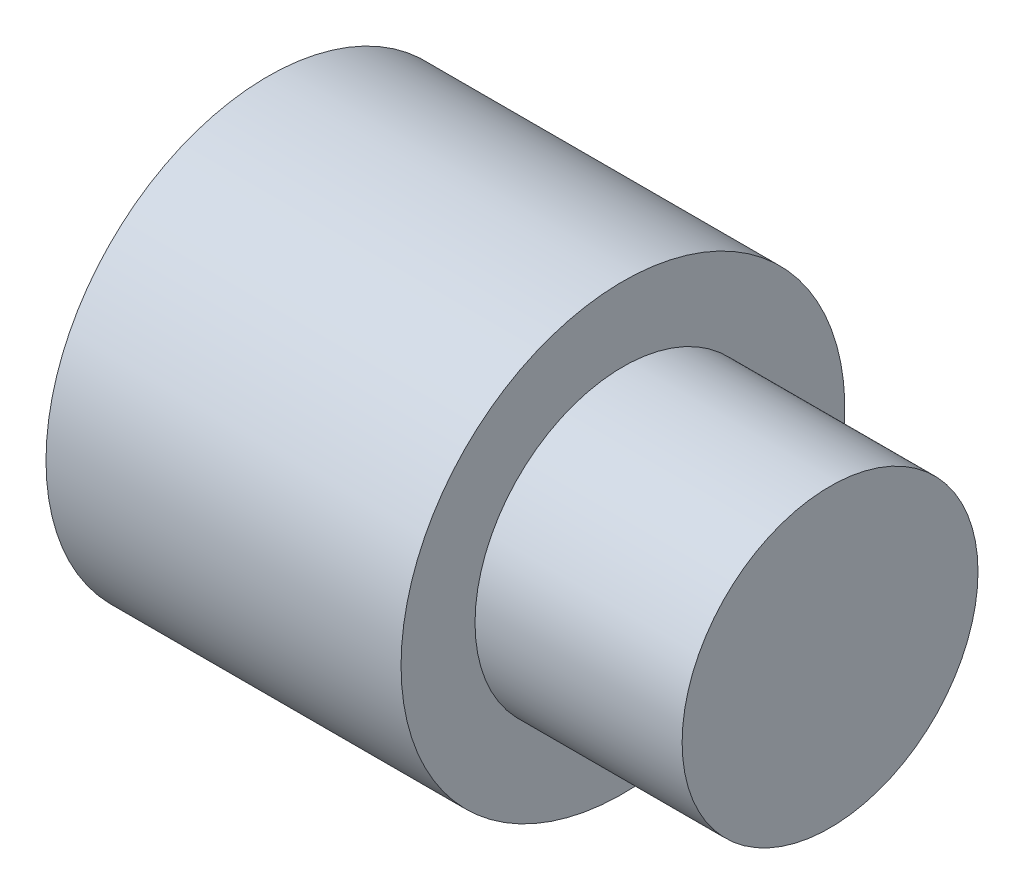
ISO-10303-21;
HEADER;
FILE_DESCRIPTION(('STEP AP214'),'2;1');
FILE_NAME('part.step','',(''),(''),'','','');
FILE_SCHEMA(('AUTOMOTIVE_DESIGN { 1 0 10303 214 1 1 1 1 }'));
ENDSEC;
DATA;
#1=APPLICATION_CONTEXT('core data for automotive mechanical design processes');
#2=APPLICATION_PROTOCOL_DEFINITION('international standard','automotive_design',2000,#1);
#3=PRODUCT_CONTEXT('',#1,'mechanical');
#4=PRODUCT('Part','Part','',(#3));
#5=PRODUCT_RELATED_PRODUCT_CATEGORY('part','',(#4));
#6=PRODUCT_DEFINITION_FORMATION('','',#4);
#7=PRODUCT_DEFINITION_CONTEXT('part definition',#1,'design');
#8=PRODUCT_DEFINITION('design','',#6,#7);
#9=PRODUCT_DEFINITION_SHAPE('','',#8);
#10=(LENGTH_UNIT() NAMED_UNIT(*) SI_UNIT(.MILLI.,.METRE.));
#11=(NAMED_UNIT(*) PLANE_ANGLE_UNIT() SI_UNIT($,.RADIAN.));
#12=(NAMED_UNIT(*) SI_UNIT($,.STERADIAN.) SOLID_ANGLE_UNIT());
#13=UNCERTAINTY_MEASURE_WITH_UNIT(LENGTH_MEASURE(1.E-05),#10,'distance_accuracy_value','');
#14=(GEOMETRIC_REPRESENTATION_CONTEXT(3) GLOBAL_UNCERTAINTY_ASSIGNED_CONTEXT((#13)) GLOBAL_UNIT_ASSIGNED_CONTEXT((#10,
#11,#12)) REPRESENTATION_CONTEXT('',''));
#15=CARTESIAN_POINT('',(0.,0.,0.));
#16=DIRECTION('',(0.,0.,1.));
#17=DIRECTION('',(1.,0.,0.));
#18=AXIS2_PLACEMENT_3D('',#15,#16,#17);
#19=CARTESIAN_POINT('',(14.,0.,0.));
#20=DIRECTION('',(-1.,0.,0.));
#21=DIRECTION('',(0.,0.,1.));
#22=AXIS2_PLACEMENT_3D('',#19,#20,#21);
#23=PLANE('',#22);
#24=CARTESIAN_POINT('',(14.,0.,0.));
#25=DIRECTION('',(-1.,0.,0.));
#26=DIRECTION('',(0.,0.,1.));
#27=AXIS2_PLACEMENT_3D('',#24,#25,#26);
#28=CIRCLE('',#27,10.);
#29=CARTESIAN_POINT('',(14.,0.,10.));
#30=VERTEX_POINT('',#29);
#31=EDGE_CURVE('E10',#30,#30,#28,.T.);
#32=ORIENTED_EDGE('',*,*,#31,.F.);
#33=EDGE_LOOP('',(#32));
#34=FACE_BOUND('',#33,.T.);
#35=ADVANCED_FACE('F39',(#34),#23,.F.);
#36=CARTESIAN_POINT('',(-1000.,0.,0.));
#37=DIRECTION('',(-1.,0.,0.));
#38=DIRECTION('',(0.,0.,1.));
#39=AXIS2_PLACEMENT_3D('',#36,#37,#38);
#40=CYLINDRICAL_SURFACE('',#39,10.);
#41=CARTESIAN_POINT('',(0.,0.,0.));
#42=DIRECTION('',(-1.,0.,0.));
#43=DIRECTION('',(0.,0.,1.));
#44=AXIS2_PLACEMENT_3D('',#41,#42,#43);
#45=CIRCLE('',#44,10.);
#46=CARTESIAN_POINT('',(0.,0.,10.));
#47=VERTEX_POINT('',#46);
#48=EDGE_CURVE('E46',#47,#47,#45,.T.);
#49=ORIENTED_EDGE('',*,*,#48,.F.);
#50=EDGE_LOOP('',(#49));
#51=FACE_BOUND('',#50,.T.);
#52=ORIENTED_EDGE('',*,*,#31,.T.);
#53=EDGE_LOOP('',(#52));
#54=FACE_BOUND('',#53,.T.);
#55=ADVANCED_FACE('F84',(#51,#54),#40,.T.);
#56=CARTESIAN_POINT('',(0.,10.,0.));
#57=DIRECTION('',(-1.,0.,0.));
#58=DIRECTION('',(0.,0.,1.));
#59=AXIS2_PLACEMENT_3D('',#56,#57,#58);
#60=PLANE('',#59);
#61=CARTESIAN_POINT('',(0.,0.,0.));
#62=DIRECTION('',(-1.,0.,0.));
#63=DIRECTION('',(0.,0.,1.));
#64=AXIS2_PLACEMENT_3D('',#61,#62,#63);
#65=CIRCLE('',#64,15.);
#66=CARTESIAN_POINT('',(0.,0.,15.));
#67=VERTEX_POINT('',#66);
#68=EDGE_CURVE('E49',#67,#67,#65,.T.);
#69=ORIENTED_EDGE('',*,*,#68,.F.);
#70=EDGE_LOOP('',(#69));
#71=FACE_BOUND('',#70,.T.);
#72=ORIENTED_EDGE('',*,*,#48,.T.);
#73=EDGE_LOOP('',(#72));
#74=FACE_BOUND('',#73,.T.);
#75=ADVANCED_FACE('F79',(#71,#74),#60,.F.);
#76=CARTESIAN_POINT('',(-1000.,0.,0.));
#77=DIRECTION('',(-1.,0.,0.));
#78=DIRECTION('',(0.,0.,1.));
#79=AXIS2_PLACEMENT_3D('',#76,#77,#78);
#80=CYLINDRICAL_SURFACE('',#79,15.);
#81=CARTESIAN_POINT('',(-24.,0.,0.));
#82=DIRECTION('',(-1.,0.,0.));
#83=DIRECTION('',(0.,0.,1.));
#84=AXIS2_PLACEMENT_3D('',#81,#82,#83);
#85=CIRCLE('',#84,15.);
#86=CARTESIAN_POINT('',(-24.,0.,15.));
#87=VERTEX_POINT('',#86);
#88=EDGE_CURVE('E54',#87,#87,#85,.T.);
#89=ORIENTED_EDGE('',*,*,#88,.F.);
#90=EDGE_LOOP('',(#89));
#91=FACE_BOUND('',#90,.T.);
#92=ORIENTED_EDGE('',*,*,#68,.T.);
#93=EDGE_LOOP('',(#92));
#94=FACE_BOUND('',#93,.T.);
#95=ADVANCED_FACE('F68',(#91,#94),#80,.T.);
#96=CARTESIAN_POINT('',(-24.,15.,0.));
#97=DIRECTION('',(1.,0.,0.));
#98=DIRECTION('',(0.,0.,-1.));
#99=AXIS2_PLACEMENT_3D('',#96,#97,#98);
#100=PLANE('',#99);
#101=CARTESIAN_POINT('',(-24.,0.,0.));
#102=DIRECTION('',(1.,0.,0.));
#103=DIRECTION('',(0.,0.,-1.));
#104=AXIS2_PLACEMENT_3D('',#101,#102,#103);
#105=CIRCLE('',#104,4.953);
#106=CARTESIAN_POINT('',(-24.,0.,-4.953));
#107=VERTEX_POINT('',#106);
#108=EDGE_CURVE('E45',#107,#107,#105,.F.);
#109=ORIENTED_EDGE('',*,*,#108,.F.);
#110=EDGE_LOOP('',(#109));
#111=FACE_BOUND('',#110,.T.);
#112=ORIENTED_EDGE('',*,*,#88,.T.);
#113=EDGE_LOOP('',(#112));
#114=FACE_BOUND('',#113,.T.);
#115=ADVANCED_FACE('F69',(#111,#114),#100,.F.);
#116=CARTESIAN_POINT('',(-1000.,0.,0.));
#117=DIRECTION('',(-1.,0.,0.));
#118=DIRECTION('',(0.,0.,1.));
#119=AXIS2_PLACEMENT_3D('',#116,#117,#118);
#120=CYLINDRICAL_SURFACE('',#119,4.953);
#121=CARTESIAN_POINT('',(-13.5,0.,0.));
#122=DIRECTION('',(-1.,0.,0.));
#123=DIRECTION('',(0.,0.,1.));
#124=AXIS2_PLACEMENT_3D('',#121,#122,#123);
#125=CIRCLE('',#124,4.953);
#126=CARTESIAN_POINT('',(-13.5,0.,4.953));
#127=VERTEX_POINT('',#126);
#128=EDGE_CURVE('E59',#127,#127,#125,.T.);
#129=ORIENTED_EDGE('',*,*,#128,.F.);
#130=EDGE_LOOP('',(#129));
#131=FACE_BOUND('',#130,.T.);
#132=ORIENTED_EDGE('',*,*,#108,.T.);
#133=EDGE_LOOP('',(#132));
#134=FACE_BOUND('',#133,.T.);
#135=ADVANCED_FACE('F62',(#131,#134),#120,.F.);
#136=CARTESIAN_POINT('',(-13.5,4.953,0.));
#137=DIRECTION('',(-1.,0.,0.));
#138=DIRECTION('',(0.,0.,1.));
#139=AXIS2_PLACEMENT_3D('',#136,#137,#138);
#140=PLANE('',#139);
#141=ORIENTED_EDGE('',*,*,#128,.T.);
#142=EDGE_LOOP('',(#141));
#143=FACE_BOUND('',#142,.T.);
#144=ADVANCED_FACE('F94',(#143),#140,.T.);
#145=CLOSED_SHELL('',(#35,#55,#75,#95,#115,#135,#144));
#146=MANIFOLD_SOLID_BREP('B2',#145);
#147=ADVANCED_BREP_SHAPE_REPRESENTATION('',(#18,#146),#14);
#148=SHAPE_DEFINITION_REPRESENTATION(#9,#147);
ENDSEC;
END-ISO-10303-21;
